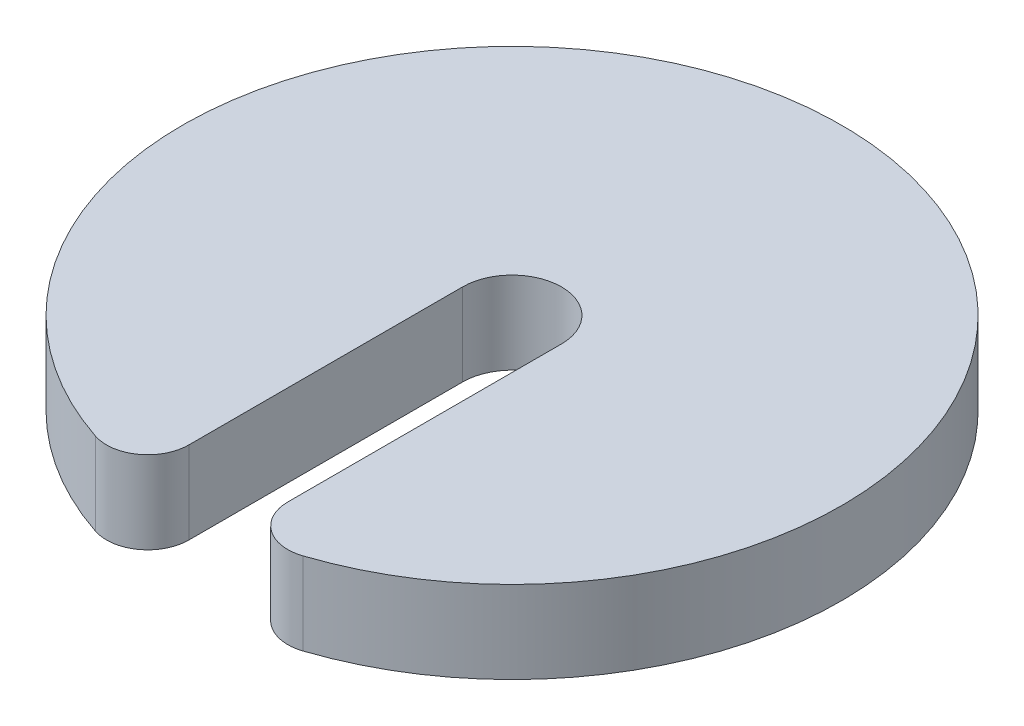
ISO-10303-21;
HEADER;
FILE_DESCRIPTION(('STEP AP214'),'2;1');
FILE_NAME('part.step','',(''),(''),'','','');
FILE_SCHEMA(('AUTOMOTIVE_DESIGN { 1 0 10303 214 1 1 1 1 }'));
ENDSEC;
DATA;
#1=APPLICATION_CONTEXT('core data for automotive mechanical design processes');
#2=APPLICATION_PROTOCOL_DEFINITION('international standard','automotive_design',2000,#1);
#3=PRODUCT_CONTEXT('',#1,'mechanical');
#4=PRODUCT('Part','Part','',(#3));
#5=PRODUCT_RELATED_PRODUCT_CATEGORY('part','',(#4));
#6=PRODUCT_DEFINITION_FORMATION('','',#4);
#7=PRODUCT_DEFINITION_CONTEXT('part definition',#1,'design');
#8=PRODUCT_DEFINITION('design','',#6,#7);
#9=PRODUCT_DEFINITION_SHAPE('','',#8);
#10=(LENGTH_UNIT() NAMED_UNIT(*) SI_UNIT(.MILLI.,.METRE.));
#11=(NAMED_UNIT(*) PLANE_ANGLE_UNIT() SI_UNIT($,.RADIAN.));
#12=(NAMED_UNIT(*) SI_UNIT($,.STERADIAN.) SOLID_ANGLE_UNIT());
#13=UNCERTAINTY_MEASURE_WITH_UNIT(LENGTH_MEASURE(1.E-05),#10,'distance_accuracy_value','');
#14=(GEOMETRIC_REPRESENTATION_CONTEXT(3) GLOBAL_UNCERTAINTY_ASSIGNED_CONTEXT((#13)) GLOBAL_UNIT_ASSIGNED_CONTEXT((#10,
#11,#12)) REPRESENTATION_CONTEXT('',''));
#15=CARTESIAN_POINT('',(0.,0.,0.));
#16=DIRECTION('',(0.,0.,1.));
#17=DIRECTION('',(1.,0.,0.));
#18=AXIS2_PLACEMENT_3D('',#15,#16,#17);
#19=CARTESIAN_POINT('',(11.,10.,33.2264954516723));
#20=DIRECTION('',(0.,-1.,0.));
#21=DIRECTION('',(0.,0.,-1.));
#22=AXIS2_PLACEMENT_3D('',#19,#20,#21);
#23=CYLINDRICAL_SURFACE('',#22,4.99999999999999);
#24=CARTESIAN_POINT('',(11.,0.,33.2264954516723));
#25=DIRECTION('',(0.,1.,0.));
#26=DIRECTION('',(0.,0.,1.));
#27=AXIS2_PLACEMENT_3D('',#24,#25,#26);
#28=CIRCLE('',#27,4.99999999999999);
#29=CARTESIAN_POINT('',(6.,0.,33.2264954516723));
#30=VERTEX_POINT('',#29);
#31=CARTESIAN_POINT('',(12.5714285714286,0.,37.973137659054));
#32=VERTEX_POINT('',#31);
#33=EDGE_CURVE('E132',#30,#32,#28,.T.);
#34=ORIENTED_EDGE('',*,*,#33,.T.);
#35=DIRECTION('',(0.,-1.,0.));
#36=VECTOR('',#35,1.);
#37=CARTESIAN_POINT('',(12.5714285714286,10.,37.973137659054));
#38=LINE('',#37,#36);
#39=CARTESIAN_POINT('',(12.5714285714286,10.,37.973137659054));
#40=VERTEX_POINT('',#39);
#41=EDGE_CURVE('E11',#40,#32,#38,.T.);
#42=ORIENTED_EDGE('',*,*,#41,.F.);
#43=CARTESIAN_POINT('',(11.,10.,33.2264954516723));
#44=DIRECTION('',(0.,1.,0.));
#45=DIRECTION('',(0.,0.,1.));
#46=AXIS2_PLACEMENT_3D('',#43,#44,#45);
#47=CIRCLE('',#46,4.99999999999999);
#48=CARTESIAN_POINT('',(6.,10.,33.2264954516723));
#49=VERTEX_POINT('',#48);
#50=EDGE_CURVE('E148',#49,#40,#47,.T.);
#51=ORIENTED_EDGE('',*,*,#50,.F.);
#52=DIRECTION('',(0.,-1.,0.));
#53=VECTOR('',#52,1.);
#54=CARTESIAN_POINT('',(6.,10.,33.2264954516723));
#55=LINE('',#54,#53);
#56=EDGE_CURVE('E128',#49,#30,#55,.T.);
#57=ORIENTED_EDGE('',*,*,#56,.T.);
#58=EDGE_LOOP('',(#34,#42,#51,#57));
#59=FACE_BOUND('',#58,.T.);
#60=ADVANCED_FACE('F42',(#59),#23,.T.);
#61=CARTESIAN_POINT('',(0.,10.,0.));
#62=DIRECTION('',(0.,-1.,0.));
#63=DIRECTION('',(0.,0.,-1.));
#64=AXIS2_PLACEMENT_3D('',#61,#62,#63);
#65=CYLINDRICAL_SURFACE('',#64,40.);
#66=CARTESIAN_POINT('',(0.,0.,0.));
#67=DIRECTION('',(0.,1.,0.));
#68=DIRECTION('',(0.,0.,1.));
#69=AXIS2_PLACEMENT_3D('',#66,#67,#68);
#70=CIRCLE('',#69,40.);
#71=CARTESIAN_POINT('',(-12.5714285714286,0.,37.973137659054));
#72=VERTEX_POINT('',#71);
#73=EDGE_CURVE('E136',#32,#72,#70,.T.);
#74=ORIENTED_EDGE('',*,*,#73,.T.);
#75=DIRECTION('',(0.,-1.,0.));
#76=VECTOR('',#75,1.);
#77=CARTESIAN_POINT('',(-12.5714285714286,10.,37.973137659054));
#78=LINE('',#77,#76);
#79=CARTESIAN_POINT('',(-12.5714285714286,10.,37.973137659054));
#80=VERTEX_POINT('',#79);
#81=EDGE_CURVE('E51',#80,#72,#78,.T.);
#82=ORIENTED_EDGE('',*,*,#81,.F.);
#83=CARTESIAN_POINT('',(0.,10.,0.));
#84=DIRECTION('',(0.,1.,0.));
#85=DIRECTION('',(0.,0.,1.));
#86=AXIS2_PLACEMENT_3D('',#83,#84,#85);
#87=CIRCLE('',#86,40.);
#88=EDGE_CURVE('E96',#40,#80,#87,.T.);
#89=ORIENTED_EDGE('',*,*,#88,.F.);
#90=ORIENTED_EDGE('',*,*,#41,.T.);
#91=EDGE_LOOP('',(#74,#82,#89,#90));
#92=FACE_BOUND('',#91,.T.);
#93=ADVANCED_FACE('F177',(#92),#65,.T.);
#94=CARTESIAN_POINT('',(-11.,10.,33.2264954516723));
#95=DIRECTION('',(0.,-1.,0.));
#96=DIRECTION('',(0.,0.,-1.));
#97=AXIS2_PLACEMENT_3D('',#94,#95,#96);
#98=CYLINDRICAL_SURFACE('',#97,4.99999999999999);
#99=CARTESIAN_POINT('',(-11.,0.,33.2264954516723));
#100=DIRECTION('',(0.,1.,0.));
#101=DIRECTION('',(0.,0.,-1.));
#102=AXIS2_PLACEMENT_3D('',#99,#100,#101);
#103=CIRCLE('',#102,4.99999999999999);
#104=CARTESIAN_POINT('',(-6.,0.,33.2264954516723));
#105=VERTEX_POINT('',#104);
#106=EDGE_CURVE('E139',#72,#105,#103,.T.);
#107=ORIENTED_EDGE('',*,*,#106,.T.);
#108=DIRECTION('',(0.,-1.,0.));
#109=VECTOR('',#108,1.);
#110=CARTESIAN_POINT('',(-6.,10.,33.2264954516723));
#111=LINE('',#110,#109);
#112=CARTESIAN_POINT('',(-6.,10.,33.2264954516723));
#113=VERTEX_POINT('',#112);
#114=EDGE_CURVE('E120',#113,#105,#111,.T.);
#115=ORIENTED_EDGE('',*,*,#114,.F.);
#116=CARTESIAN_POINT('',(-11.,10.,33.2264954516723));
#117=DIRECTION('',(0.,1.,0.));
#118=DIRECTION('',(0.,0.,-1.));
#119=AXIS2_PLACEMENT_3D('',#116,#117,#118);
#120=CIRCLE('',#119,4.99999999999999);
#121=EDGE_CURVE('E109',#80,#113,#120,.T.);
#122=ORIENTED_EDGE('',*,*,#121,.F.);
#123=ORIENTED_EDGE('',*,*,#81,.T.);
#124=EDGE_LOOP('',(#107,#115,#122,#123));
#125=FACE_BOUND('',#124,.T.);
#126=ADVANCED_FACE('F159',(#125),#98,.T.);
#127=CARTESIAN_POINT('',(-6.,10.,0.));
#128=DIRECTION('',(-1.,0.,0.));
#129=DIRECTION('',(0.,0.,1.));
#130=AXIS2_PLACEMENT_3D('',#127,#128,#129);
#131=PLANE('',#130);
#132=DIRECTION('',(0.,0.,-1.));
#133=VECTOR('',#132,1.);
#134=CARTESIAN_POINT('',(-6.,0.,0.));
#135=LINE('',#134,#133);
#136=CARTESIAN_POINT('',(-6.,0.,0.));
#137=VERTEX_POINT('',#136);
#138=EDGE_CURVE('E118',#105,#137,#135,.T.);
#139=ORIENTED_EDGE('',*,*,#138,.T.);
#140=DIRECTION('',(0.,-1.,0.));
#141=VECTOR('',#140,1.);
#142=CARTESIAN_POINT('',(-6.,10.,0.));
#143=LINE('',#142,#141);
#144=CARTESIAN_POINT('',(-6.,10.,0.));
#145=VERTEX_POINT('',#144);
#146=EDGE_CURVE('E115',#145,#137,#143,.T.);
#147=ORIENTED_EDGE('',*,*,#146,.F.);
#148=DIRECTION('',(0.,0.,-1.));
#149=VECTOR('',#148,1.);
#150=CARTESIAN_POINT('',(-6.,10.,0.));
#151=LINE('',#150,#149);
#152=EDGE_CURVE('E103',#113,#145,#151,.T.);
#153=ORIENTED_EDGE('',*,*,#152,.F.);
#154=ORIENTED_EDGE('',*,*,#114,.T.);
#155=EDGE_LOOP('',(#139,#147,#153,#154));
#156=FACE_BOUND('',#155,.T.);
#157=ADVANCED_FACE('F116',(#156),#131,.F.);
#158=CARTESIAN_POINT('',(0.,10.,0.));
#159=DIRECTION('',(0.,-1.,0.));
#160=DIRECTION('',(0.,0.,-1.));
#161=AXIS2_PLACEMENT_3D('',#158,#159,#160);
#162=CYLINDRICAL_SURFACE('',#161,6.);
#163=CARTESIAN_POINT('',(0.,0.,0.));
#164=DIRECTION('',(0.,-1.,0.));
#165=DIRECTION('',(0.,0.,1.));
#166=AXIS2_PLACEMENT_3D('',#163,#164,#165);
#167=CIRCLE('',#166,6.);
#168=CARTESIAN_POINT('',(6.,0.,0.));
#169=VERTEX_POINT('',#168);
#170=EDGE_CURVE('E82',#137,#169,#167,.T.);
#171=ORIENTED_EDGE('',*,*,#170,.T.);
#172=DIRECTION('',(0.,-1.,0.));
#173=VECTOR('',#172,1.);
#174=CARTESIAN_POINT('',(6.,10.,0.));
#175=LINE('',#174,#173);
#176=CARTESIAN_POINT('',(6.,10.,0.));
#177=VERTEX_POINT('',#176);
#178=EDGE_CURVE('E121',#177,#169,#175,.T.);
#179=ORIENTED_EDGE('',*,*,#178,.F.);
#180=CARTESIAN_POINT('',(0.,10.,0.));
#181=DIRECTION('',(0.,-1.,0.));
#182=DIRECTION('',(0.,0.,1.));
#183=AXIS2_PLACEMENT_3D('',#180,#181,#182);
#184=CIRCLE('',#183,6.);
#185=EDGE_CURVE('E107',#145,#177,#184,.T.);
#186=ORIENTED_EDGE('',*,*,#185,.F.);
#187=ORIENTED_EDGE('',*,*,#146,.T.);
#188=EDGE_LOOP('',(#171,#179,#186,#187));
#189=FACE_BOUND('',#188,.T.);
#190=ADVANCED_FACE('F123',(#189),#162,.F.);
#191=CARTESIAN_POINT('',(6.,10.,0.));
#192=DIRECTION('',(1.,0.,0.));
#193=DIRECTION('',(0.,0.,-1.));
#194=AXIS2_PLACEMENT_3D('',#191,#192,#193);
#195=PLANE('',#194);
#196=DIRECTION('',(0.,0.,1.));
#197=VECTOR('',#196,1.);
#198=CARTESIAN_POINT('',(6.,0.,0.));
#199=LINE('',#198,#197);
#200=EDGE_CURVE('E88',#169,#30,#199,.T.);
#201=ORIENTED_EDGE('',*,*,#200,.T.);
#202=ORIENTED_EDGE('',*,*,#56,.F.);
#203=DIRECTION('',(0.,0.,1.));
#204=VECTOR('',#203,1.);
#205=CARTESIAN_POINT('',(6.,10.,0.));
#206=LINE('',#205,#204);
#207=EDGE_CURVE('E59',#177,#49,#206,.T.);
#208=ORIENTED_EDGE('',*,*,#207,.F.);
#209=ORIENTED_EDGE('',*,*,#178,.T.);
#210=EDGE_LOOP('',(#201,#202,#208,#209));
#211=FACE_BOUND('',#210,.T.);
#212=ADVANCED_FACE('F166',(#211),#195,.F.);
#213=CARTESIAN_POINT('',(11.,10.,33.2264954516723));
#214=DIRECTION('',(0.,1.,0.));
#215=DIRECTION('',(0.,0.,1.));
#216=AXIS2_PLACEMENT_3D('',#213,#214,#215);
#217=PLANE('',#216);
#218=ORIENTED_EDGE('',*,*,#50,.T.);
#219=ORIENTED_EDGE('',*,*,#88,.T.);
#220=ORIENTED_EDGE('',*,*,#121,.T.);
#221=ORIENTED_EDGE('',*,*,#152,.T.);
#222=ORIENTED_EDGE('',*,*,#185,.T.);
#223=ORIENTED_EDGE('',*,*,#207,.T.);
#224=EDGE_LOOP('',(#218,#219,#220,#221,#222,#223));
#225=FACE_BOUND('',#224,.T.);
#226=ADVANCED_FACE('F105',(#225),#217,.T.);
#227=CARTESIAN_POINT('',(11.,0.,33.2264954516723));
#228=DIRECTION('',(0.,1.,0.));
#229=DIRECTION('',(0.,0.,1.));
#230=AXIS2_PLACEMENT_3D('',#227,#228,#229);
#231=PLANE('',#230);
#232=ORIENTED_EDGE('',*,*,#33,.F.);
#233=ORIENTED_EDGE('',*,*,#200,.F.);
#234=ORIENTED_EDGE('',*,*,#170,.F.);
#235=ORIENTED_EDGE('',*,*,#138,.F.);
#236=ORIENTED_EDGE('',*,*,#106,.F.);
#237=ORIENTED_EDGE('',*,*,#73,.F.);
#238=EDGE_LOOP('',(#232,#233,#234,#235,#236,#237));
#239=FACE_BOUND('',#238,.T.);
#240=ADVANCED_FACE('F162',(#239),#231,.F.);
#241=CLOSED_SHELL('',(#60,#93,#126,#157,#190,#212,#226,#240));
#242=MANIFOLD_SOLID_BREP('B2',#241);
#243=ADVANCED_BREP_SHAPE_REPRESENTATION('',(#18,#242),#14);
#244=SHAPE_DEFINITION_REPRESENTATION(#9,#243);
ENDSEC;
END-ISO-10303-21;
